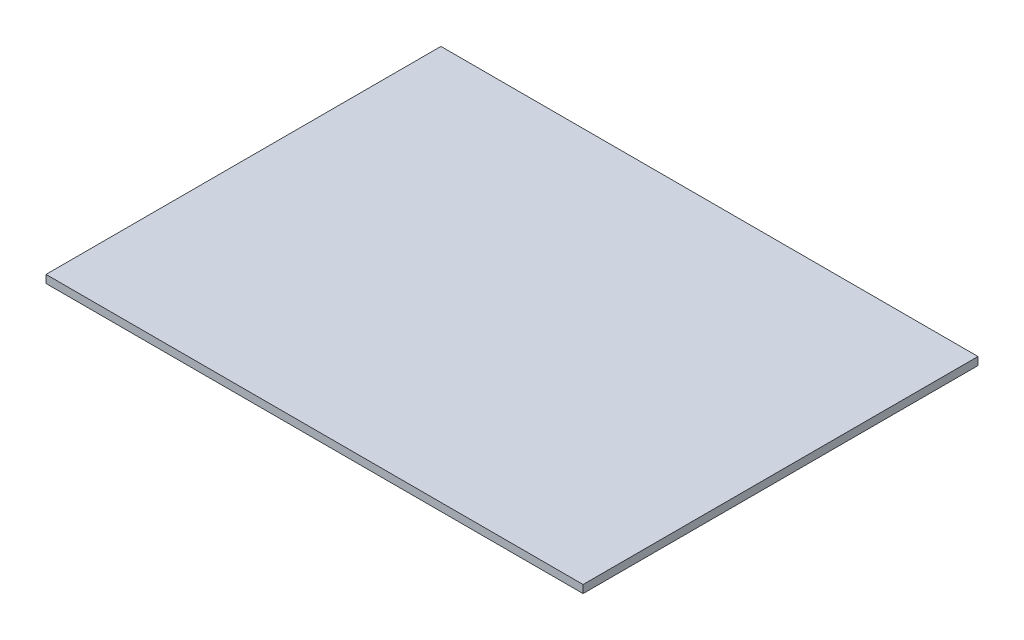
ISO-10303-21;
HEADER;
FILE_DESCRIPTION(('STEP AP214'),'2;1');
FILE_NAME('part.step','',(''),(''),'','','');
FILE_SCHEMA(('AUTOMOTIVE_DESIGN { 1 0 10303 214 1 1 1 1 }'));
ENDSEC;
DATA;
#1=APPLICATION_CONTEXT('core data for automotive mechanical design processes');
#2=APPLICATION_PROTOCOL_DEFINITION('international standard','automotive_design',2000,#1);
#3=PRODUCT_CONTEXT('',#1,'mechanical');
#4=PRODUCT('Part','Part','',(#3));
#5=PRODUCT_RELATED_PRODUCT_CATEGORY('part','',(#4));
#6=PRODUCT_DEFINITION_FORMATION('','',#4);
#7=PRODUCT_DEFINITION_CONTEXT('part definition',#1,'design');
#8=PRODUCT_DEFINITION('design','',#6,#7);
#9=PRODUCT_DEFINITION_SHAPE('','',#8);
#10=(LENGTH_UNIT() NAMED_UNIT(*) SI_UNIT(.MILLI.,.METRE.));
#11=(NAMED_UNIT(*) PLANE_ANGLE_UNIT() SI_UNIT($,.RADIAN.));
#12=(NAMED_UNIT(*) SI_UNIT($,.STERADIAN.) SOLID_ANGLE_UNIT());
#13=UNCERTAINTY_MEASURE_WITH_UNIT(LENGTH_MEASURE(1.E-05),#10,'distance_accuracy_value','');
#14=(GEOMETRIC_REPRESENTATION_CONTEXT(3) GLOBAL_UNCERTAINTY_ASSIGNED_CONTEXT((#13)) GLOBAL_UNIT_ASSIGNED_CONTEXT((#10,
#11,#12)) REPRESENTATION_CONTEXT('',''));
#15=CARTESIAN_POINT('',(0.,0.,0.));
#16=DIRECTION('',(0.,0.,1.));
#17=DIRECTION('',(1.,0.,0.));
#18=AXIS2_PLACEMENT_3D('',#15,#16,#17);
#19=CARTESIAN_POINT('',(170.,5.,125.));
#20=DIRECTION('',(-1.,0.,0.));
#21=DIRECTION('',(0.,0.,1.));
#22=AXIS2_PLACEMENT_3D('',#19,#20,#21);
#23=PLANE('',#22);
#24=DIRECTION('',(0.,0.,-1.));
#25=VECTOR('',#24,1.);
#26=CARTESIAN_POINT('',(170.,0.,125.));
#27=LINE('',#26,#25);
#28=CARTESIAN_POINT('',(170.,0.,125.));
#29=VERTEX_POINT('',#28);
#30=CARTESIAN_POINT('',(170.,0.,-125.));
#31=VERTEX_POINT('',#30);
#32=EDGE_CURVE('E111',#29,#31,#27,.T.);
#33=ORIENTED_EDGE('',*,*,#32,.T.);
#34=DIRECTION('',(0.,-1.,0.));
#35=VECTOR('',#34,1.);
#36=CARTESIAN_POINT('',(170.,5.,-125.));
#37=LINE('',#36,#35);
#38=CARTESIAN_POINT('',(170.,5.,-125.));
#39=VERTEX_POINT('',#38);
#40=EDGE_CURVE('E11',#39,#31,#37,.T.);
#41=ORIENTED_EDGE('',*,*,#40,.F.);
#42=DIRECTION('',(0.,0.,-1.));
#43=VECTOR('',#42,1.);
#44=CARTESIAN_POINT('',(170.,5.,125.));
#45=LINE('',#44,#43);
#46=CARTESIAN_POINT('',(170.,5.,125.));
#47=VERTEX_POINT('',#46);
#48=EDGE_CURVE('E95',#47,#39,#45,.T.);
#49=ORIENTED_EDGE('',*,*,#48,.F.);
#50=DIRECTION('',(0.,-1.,0.));
#51=VECTOR('',#50,1.);
#52=CARTESIAN_POINT('',(170.,5.,125.));
#53=LINE('',#52,#51);
#54=EDGE_CURVE('E107',#47,#29,#53,.T.);
#55=ORIENTED_EDGE('',*,*,#54,.T.);
#56=EDGE_LOOP('',(#33,#41,#49,#55));
#57=FACE_BOUND('',#56,.T.);
#58=ADVANCED_FACE('F43',(#57),#23,.F.);
#59=CARTESIAN_POINT('',(-170.,5.,-125.));
#60=DIRECTION('',(0.,0.,1.));
#61=DIRECTION('',(1.,0.,0.));
#62=AXIS2_PLACEMENT_3D('',#59,#60,#61);
#63=PLANE('',#62);
#64=DIRECTION('',(-1.,0.,0.));
#65=VECTOR('',#64,1.);
#66=CARTESIAN_POINT('',(-170.,0.,-125.));
#67=LINE('',#66,#65);
#68=CARTESIAN_POINT('',(-170.,0.,-125.));
#69=VERTEX_POINT('',#68);
#70=EDGE_CURVE('E100',#31,#69,#67,.T.);
#71=ORIENTED_EDGE('',*,*,#70,.T.);
#72=DIRECTION('',(0.,-1.,0.));
#73=VECTOR('',#72,1.);
#74=CARTESIAN_POINT('',(-170.,5.,-125.));
#75=LINE('',#74,#73);
#76=CARTESIAN_POINT('',(-170.,5.,-125.));
#77=VERTEX_POINT('',#76);
#78=EDGE_CURVE('E52',#77,#69,#75,.T.);
#79=ORIENTED_EDGE('',*,*,#78,.F.);
#80=DIRECTION('',(-1.,0.,0.));
#81=VECTOR('',#80,1.);
#82=CARTESIAN_POINT('',(-170.,5.,-125.));
#83=LINE('',#82,#81);
#84=EDGE_CURVE('E90',#39,#77,#83,.T.);
#85=ORIENTED_EDGE('',*,*,#84,.F.);
#86=ORIENTED_EDGE('',*,*,#40,.T.);
#87=EDGE_LOOP('',(#71,#79,#85,#86));
#88=FACE_BOUND('',#87,.T.);
#89=ADVANCED_FACE('F99',(#88),#63,.F.);
#90=CARTESIAN_POINT('',(-170.,5.,125.));
#91=DIRECTION('',(1.,0.,0.));
#92=DIRECTION('',(0.,0.,-1.));
#93=AXIS2_PLACEMENT_3D('',#90,#91,#92);
#94=PLANE('',#93);
#95=DIRECTION('',(0.,0.,1.));
#96=VECTOR('',#95,1.);
#97=CARTESIAN_POINT('',(-170.,0.,125.));
#98=LINE('',#97,#96);
#99=CARTESIAN_POINT('',(-170.,0.,125.));
#100=VERTEX_POINT('',#99);
#101=EDGE_CURVE('E77',#69,#100,#98,.T.);
#102=ORIENTED_EDGE('',*,*,#101,.T.);
#103=DIRECTION('',(0.,-1.,0.));
#104=VECTOR('',#103,1.);
#105=CARTESIAN_POINT('',(-170.,5.,125.));
#106=LINE('',#105,#104);
#107=CARTESIAN_POINT('',(-170.,5.,125.));
#108=VERTEX_POINT('',#107);
#109=EDGE_CURVE('E102',#108,#100,#106,.T.);
#110=ORIENTED_EDGE('',*,*,#109,.F.);
#111=DIRECTION('',(0.,0.,1.));
#112=VECTOR('',#111,1.);
#113=CARTESIAN_POINT('',(-170.,5.,125.));
#114=LINE('',#113,#112);
#115=EDGE_CURVE('E93',#77,#108,#114,.T.);
#116=ORIENTED_EDGE('',*,*,#115,.F.);
#117=ORIENTED_EDGE('',*,*,#78,.T.);
#118=EDGE_LOOP('',(#102,#110,#116,#117));
#119=FACE_BOUND('',#118,.T.);
#120=ADVANCED_FACE('F103',(#119),#94,.F.);
#121=CARTESIAN_POINT('',(-170.,5.,125.));
#122=DIRECTION('',(0.,0.,-1.));
#123=DIRECTION('',(-1.,0.,0.));
#124=AXIS2_PLACEMENT_3D('',#121,#122,#123);
#125=PLANE('',#124);
#126=DIRECTION('',(1.,0.,0.));
#127=VECTOR('',#126,1.);
#128=CARTESIAN_POINT('',(-170.,0.,125.));
#129=LINE('',#128,#127);
#130=EDGE_CURVE('E83',#100,#29,#129,.T.);
#131=ORIENTED_EDGE('',*,*,#130,.T.);
#132=ORIENTED_EDGE('',*,*,#54,.F.);
#133=DIRECTION('',(1.,0.,0.));
#134=VECTOR('',#133,1.);
#135=CARTESIAN_POINT('',(-170.,5.,125.));
#136=LINE('',#135,#134);
#137=EDGE_CURVE('E60',#108,#47,#136,.T.);
#138=ORIENTED_EDGE('',*,*,#137,.F.);
#139=ORIENTED_EDGE('',*,*,#109,.T.);
#140=EDGE_LOOP('',(#131,#132,#138,#139));
#141=FACE_BOUND('',#140,.T.);
#142=ADVANCED_FACE('F124',(#141),#125,.F.);
#143=CARTESIAN_POINT('',(0.,5.,0.));
#144=DIRECTION('',(0.,-1.,0.));
#145=DIRECTION('',(0.,0.,-1.));
#146=AXIS2_PLACEMENT_3D('',#143,#144,#145);
#147=PLANE('',#146);
#148=ORIENTED_EDGE('',*,*,#48,.T.);
#149=ORIENTED_EDGE('',*,*,#84,.T.);
#150=ORIENTED_EDGE('',*,*,#115,.T.);
#151=ORIENTED_EDGE('',*,*,#137,.T.);
#152=EDGE_LOOP('',(#148,#149,#150,#151));
#153=FACE_BOUND('',#152,.T.);
#154=ADVANCED_FACE('F91',(#153),#147,.F.);
#155=CARTESIAN_POINT('',(0.,0.,0.));
#156=DIRECTION('',(0.,-1.,0.));
#157=DIRECTION('',(0.,0.,-1.));
#158=AXIS2_PLACEMENT_3D('',#155,#156,#157);
#159=PLANE('',#158);
#160=ORIENTED_EDGE('',*,*,#32,.F.);
#161=ORIENTED_EDGE('',*,*,#130,.F.);
#162=ORIENTED_EDGE('',*,*,#101,.F.);
#163=ORIENTED_EDGE('',*,*,#70,.F.);
#164=EDGE_LOOP('',(#160,#161,#162,#163));
#165=FACE_BOUND('',#164,.T.);
#166=ADVANCED_FACE('F127',(#165),#159,.T.);
#167=CLOSED_SHELL('',(#58,#89,#120,#142,#154,#166));
#168=MANIFOLD_SOLID_BREP('B2',#167);
#169=ADVANCED_BREP_SHAPE_REPRESENTATION('',(#18,#168),#14);
#170=SHAPE_DEFINITION_REPRESENTATION(#9,#169);
ENDSEC;
END-ISO-10303-21;
